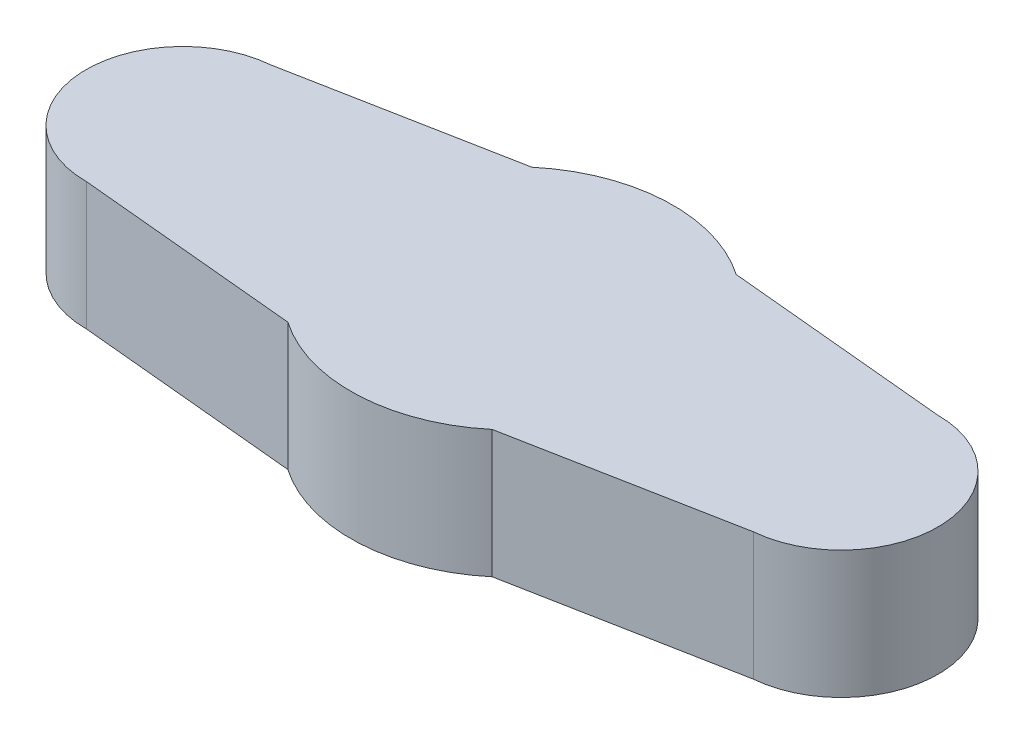
ISO-10303-21;
HEADER;
FILE_DESCRIPTION(('STEP AP214'),'2;1');
FILE_NAME('part.step','',(''),(''),'','','');
FILE_SCHEMA(('AUTOMOTIVE_DESIGN { 1 0 10303 214 1 1 1 1 }'));
ENDSEC;
DATA;
#1=APPLICATION_CONTEXT('core data for automotive mechanical design processes');
#2=APPLICATION_PROTOCOL_DEFINITION('international standard','automotive_design',2000,#1);
#3=PRODUCT_CONTEXT('',#1,'mechanical');
#4=PRODUCT('Part','Part','',(#3));
#5=PRODUCT_RELATED_PRODUCT_CATEGORY('part','',(#4));
#6=PRODUCT_DEFINITION_FORMATION('','',#4);
#7=PRODUCT_DEFINITION_CONTEXT('part definition',#1,'design');
#8=PRODUCT_DEFINITION('design','',#6,#7);
#9=PRODUCT_DEFINITION_SHAPE('','',#8);
#10=(LENGTH_UNIT() NAMED_UNIT(*) SI_UNIT(.MILLI.,.METRE.));
#11=(NAMED_UNIT(*) PLANE_ANGLE_UNIT() SI_UNIT($,.RADIAN.));
#12=(NAMED_UNIT(*) SI_UNIT($,.STERADIAN.) SOLID_ANGLE_UNIT());
#13=UNCERTAINTY_MEASURE_WITH_UNIT(LENGTH_MEASURE(1.E-05),#10,'distance_accuracy_value','');
#14=(GEOMETRIC_REPRESENTATION_CONTEXT(3) GLOBAL_UNCERTAINTY_ASSIGNED_CONTEXT((#13)) GLOBAL_UNIT_ASSIGNED_CONTEXT((#10,
#11,#12)) REPRESENTATION_CONTEXT('',''));
#15=CARTESIAN_POINT('',(0.,0.,0.));
#16=DIRECTION('',(0.,0.,1.));
#17=DIRECTION('',(1.,0.,0.));
#18=AXIS2_PLACEMENT_3D('',#15,#16,#17);
#19=CARTESIAN_POINT('',(0.,19.05,0.));
#20=DIRECTION('',(0.,1.,0.));
#21=DIRECTION('',(0.,0.,1.));
#22=AXIS2_PLACEMENT_3D('',#19,#20,#21);
#23=PLANE('',#22);
#24=CARTESIAN_POINT('',(11.4299999999997,19.05,-4.44089209850063E-13));
#25=DIRECTION('',(0.,1.,0.));
#26=DIRECTION('',(0.,0.,1.));
#27=AXIS2_PLACEMENT_3D('',#24,#25,#26);
#28=CIRCLE('',#27,2.032);
#29=CARTESIAN_POINT('',(11.4299999999997,19.05,2.03199999999955));
#30=VERTEX_POINT('',#29);
#31=EDGE_CURVE('E239',#30,#30,#28,.T.);
#32=ORIENTED_EDGE('',*,*,#31,.T.);
#33=EDGE_LOOP('',(#32));
#34=FACE_BOUND('',#33,.T.);
#35=CARTESIAN_POINT('',(11.4299999999997,19.05,-4.44089209850063E-13));
#36=DIRECTION('',(0.,1.,0.));
#37=DIRECTION('',(0.,0.,1.));
#38=AXIS2_PLACEMENT_3D('',#35,#36,#37);
#39=CIRCLE('',#38,5.9182);
#40=CARTESIAN_POINT('',(15.2680263966815,19.05,-4.50495778208606));
#41=VERTEX_POINT('',#40);
#42=CARTESIAN_POINT('',(7.18268751011818,19.05,-4.12133811441138));
#43=VERTEX_POINT('',#42);
#44=EDGE_CURVE('E231',#41,#43,#39,.T.);
#45=ORIENTED_EDGE('',*,*,#44,.F.);
#46=DIRECTION('',(-0.995557261223967,0.,-0.0941580566082036));
#47=VECTOR('',#46,1.);
#48=CARTESIAN_POINT('',(0.557655904113208,19.05,-5.89623877768044));
#49=LINE('',#48,#47);
#50=CARTESIAN_POINT('',(27.8010697747138,19.05,-3.31960455949895));
#51=VERTEX_POINT('',#50);
#52=EDGE_CURVE('E226',#51,#41,#49,.T.);
#53=ORIENTED_EDGE('',*,*,#52,.F.);
#54=CARTESIAN_POINT('',(27.9214480374196,19.05,-0.782458707588194));
#55=DIRECTION('',(0.,1.,0.));
#56=DIRECTION('',(0.,0.,1.));
#57=AXIS2_PLACEMENT_3D('',#54,#55,#56);
#58=CIRCLE('',#57,2.54);
#59=CARTESIAN_POINT('',(28.0418263001254,19.05,1.75468714432256));
#60=VERTEX_POINT('',#59);
#61=EDGE_CURVE('E221',#60,#51,#58,.T.);
#62=ORIENTED_EDGE('',*,*,#61,.F.);
#63=DIRECTION('',(0.982170182772097,0.,-0.187993968183625));
#64=VECTOR('',#63,1.);
#65=CARTESIAN_POINT('',(1.31503577863829,19.05,6.87037431858157));
#66=LINE('',#65,#64);
#67=CARTESIAN_POINT('',(15.6773124898813,19.05,4.12133811441049));
#68=VERTEX_POINT('',#67);
#69=EDGE_CURVE('E216',#68,#60,#66,.T.);
#70=ORIENTED_EDGE('',*,*,#69,.F.);
#71=CARTESIAN_POINT('',(11.4299999999997,19.05,-4.44089209850063E-13));
#72=DIRECTION('',(0.,1.,0.));
#73=DIRECTION('',(0.,0.,1.));
#74=AXIS2_PLACEMENT_3D('',#71,#72,#73);
#75=CIRCLE('',#74,5.9182);
#76=CARTESIAN_POINT('',(7.59197360331792,19.05,4.50495778208517));
#77=VERTEX_POINT('',#76);
#78=EDGE_CURVE('E211',#77,#68,#75,.T.);
#79=ORIENTED_EDGE('',*,*,#78,.F.);
#80=DIRECTION('',(0.995557261223967,0.,0.0941580566082036));
#81=VECTOR('',#80,1.);
#82=CARTESIAN_POINT('',(-0.354985096303148,19.05,3.75334839079609));
#83=LINE('',#82,#81);
#84=CARTESIAN_POINT('',(-4.94106977471436,19.05,3.31960455949806));
#85=VERTEX_POINT('',#84);
#86=EDGE_CURVE('E206',#85,#77,#83,.T.);
#87=ORIENTED_EDGE('',*,*,#86,.F.);
#88=CARTESIAN_POINT('',(-5.06144803742017,19.05,0.782458707587305));
#89=DIRECTION('',(0.,1.,0.));
#90=DIRECTION('',(0.,0.,1.));
#91=AXIS2_PLACEMENT_3D('',#88,#89,#90);
#92=CIRCLE('',#91,2.54);
#93=CARTESIAN_POINT('',(-5.18182630012598,19.05,-1.75468714432345));
#94=VERTEX_POINT('',#93);
#95=EDGE_CURVE('E67',#94,#85,#92,.T.);
#96=ORIENTED_EDGE('',*,*,#95,.F.);
#97=DIRECTION('',(-0.982170182772097,0.,0.187993968183625));
#98=VECTOR('',#97,1.);
#99=CARTESIAN_POINT('',(-0.507123783439963,19.05,-2.64945659630314));
#100=LINE('',#99,#98);
#101=EDGE_CURVE('E62',#43,#94,#100,.T.);
#102=ORIENTED_EDGE('',*,*,#101,.F.);
#103=EDGE_LOOP('',(#45,#53,#62,#70,#79,#87,#96,#102));
#104=FACE_BOUND('',#103,.T.);
#105=ADVANCED_FACE('F47',(#34,#104),#23,.F.);
#106=CARTESIAN_POINT('',(-0.984628462626367,21.209,-5.1441688605442));
#107=DIRECTION('',(0.187993968183626,0.,0.982170182772097));
#108=DIRECTION('',(0.982170182772097,0.,-0.187993968183626));
#109=AXIS2_PLACEMENT_3D('',#106,#107,#108);
#110=PLANE('',#109);
#111=DIRECTION('',(0.,-1.,0.));
#112=VECTOR('',#111,1.);
#113=CARTESIAN_POINT('',(5.99380688752038,21.209,-6.47988824624601));
#114=LINE('',#113,#112);
#115=CARTESIAN_POINT('',(5.99380688752036,23.209,-6.47988824624603));
#116=VERTEX_POINT('',#115);
#117=CARTESIAN_POINT('',(5.99380688752036,16.51,-6.47988824624603));
#118=VERTEX_POINT('',#117);
#119=EDGE_CURVE('E292',#116,#118,#114,.T.);
#120=ORIENTED_EDGE('',*,*,#119,.T.);
#121=DIRECTION('',(0.982170182772097,0.,-0.187993968183626));
#122=VECTOR('',#121,1.);
#123=CARTESIAN_POINT('',(-0.984628462626367,16.51,-5.1441688605442));
#124=LINE('',#123,#122);
#125=CARTESIAN_POINT('',(-5.5127598912651,16.51,-4.27745409903099));
#126=VERTEX_POINT('',#125);
#127=EDGE_CURVE('E229',#126,#118,#124,.T.);
#128=ORIENTED_EDGE('',*,*,#127,.F.);
#129=DIRECTION('',(0.,-1.,0.));
#130=VECTOR('',#129,1.);
#131=CARTESIAN_POINT('',(-5.5127598912651,21.209,-4.27745409903091));
#132=LINE('',#131,#130);
#133=CARTESIAN_POINT('',(-5.51275989126509,23.209,-4.27745409903091));
#134=VERTEX_POINT('',#133);
#135=EDGE_CURVE('E11',#134,#126,#132,.T.);
#136=ORIENTED_EDGE('',*,*,#135,.F.);
#137=DIRECTION('',(0.982170182772097,0.,-0.187993968183626));
#138=VECTOR('',#137,1.);
#139=CARTESIAN_POINT('',(-0.984628462626366,23.209,-5.1441688605442));
#140=LINE('',#139,#138);
#141=EDGE_CURVE('E194',#134,#116,#140,.T.);
#142=ORIENTED_EDGE('',*,*,#141,.T.);
#143=EDGE_LOOP('',(#120,#128,#136,#142));
#144=FACE_BOUND('',#143,.T.);
#145=ADVANCED_FACE('F49',(#144),#110,.F.);
#146=CARTESIAN_POINT('',(-5.06144803742015,21.209,0.782458707587308));
#147=DIRECTION('',(0.,-1.,0.));
#148=DIRECTION('',(0.,0.,-1.));
#149=AXIS2_PLACEMENT_3D('',#146,#147,#148);
#150=CYLINDRICAL_SURFACE('',#149,5.08000000000008);
#151=ORIENTED_EDGE('',*,*,#135,.T.);
#152=CARTESIAN_POINT('',(-5.06144803742015,16.51,0.782458707587308));
#153=DIRECTION('',(0.,1.,0.));
#154=DIRECTION('',(0.,0.,1.));
#155=AXIS2_PLACEMENT_3D('',#152,#153,#154);
#156=CIRCLE('',#155,5.08000000000008);
#157=CARTESIAN_POINT('',(-5.03166237176866,16.51,5.86237138539225));
#158=VERTEX_POINT('',#157);
#159=EDGE_CURVE('E236',#158,#126,#156,.F.);
#160=ORIENTED_EDGE('',*,*,#159,.F.);
#161=DIRECTION('',(0.,-1.,0.));
#162=VECTOR('',#161,1.);
#163=CARTESIAN_POINT('',(-5.03166237176866,21.209,5.86237138539225));
#164=LINE('',#163,#162);
#165=CARTESIAN_POINT('',(-5.03166237176867,23.209,5.86237138539217));
#166=VERTEX_POINT('',#165);
#167=EDGE_CURVE('E55',#166,#158,#164,.T.);
#168=ORIENTED_EDGE('',*,*,#167,.F.);
#169=CARTESIAN_POINT('',(-5.06144803742015,23.209,0.782458707587308));
#170=DIRECTION('',(0.,1.,0.));
#171=DIRECTION('',(0.,0.,1.));
#172=AXIS2_PLACEMENT_3D('',#169,#170,#171);
#173=CIRCLE('',#172,5.08000000000008);
#174=EDGE_CURVE('E191',#134,#166,#173,.T.);
#175=ORIENTED_EDGE('',*,*,#174,.F.);
#176=EDGE_LOOP('',(#151,#160,#168,#175));
#177=FACE_BOUND('',#176,.T.);
#178=ADVANCED_FACE('F311',(#177),#150,.T.);
#179=CARTESIAN_POINT('',(-0.594146560087953,21.209,6.28206383430505));
#180=DIRECTION('',(0.0941580566081974,0.,-0.995557261223968));
#181=DIRECTION('',(-0.995557261223968,0.,-0.0941580566081974));
#182=AXIS2_PLACEMENT_3D('',#179,#180,#181);
#183=PLANE('',#182);
#184=ORIENTED_EDGE('',*,*,#167,.T.);
#185=DIRECTION('',(-0.995557261223968,0.,-0.0941580566081974));
#186=VECTOR('',#185,1.);
#187=CARTESIAN_POINT('',(-0.594146560087953,16.51,6.28206383430505));
#188=LINE('',#187,#186);
#189=CARTESIAN_POINT('',(6.63174007040923,16.51,6.96547549619408));
#190=VERTEX_POINT('',#189);
#191=EDGE_CURVE('E240',#190,#158,#188,.T.);
#192=ORIENTED_EDGE('',*,*,#191,.F.);
#193=DIRECTION('',(0.,-1.,0.));
#194=VECTOR('',#193,1.);
#195=CARTESIAN_POINT('',(6.63174007040923,21.209,6.96547549619408));
#196=LINE('',#195,#194);
#197=CARTESIAN_POINT('',(6.63174007040925,23.209,6.96547549619409));
#198=VERTEX_POINT('',#197);
#199=EDGE_CURVE('E298',#198,#190,#196,.T.);
#200=ORIENTED_EDGE('',*,*,#199,.F.);
#201=DIRECTION('',(-0.995557261223968,0.,-0.0941580566081974));
#202=VECTOR('',#201,1.);
#203=CARTESIAN_POINT('',(-0.594146560087953,23.209,6.28206383430505));
#204=LINE('',#203,#202);
#205=EDGE_CURVE('E188',#198,#166,#204,.T.);
#206=ORIENTED_EDGE('',*,*,#205,.T.);
#207=EDGE_LOOP('',(#184,#192,#200,#206));
#208=FACE_BOUND('',#207,.T.);
#209=ADVANCED_FACE('F301',(#208),#183,.F.);
#210=CARTESIAN_POINT('',(11.4299999999997,21.209,-4.44089209850063E-13));
#211=DIRECTION('',(0.,-1.,0.));
#212=DIRECTION('',(0.,0.,-1.));
#213=AXIS2_PLACEMENT_3D('',#210,#211,#212);
#214=CYLINDRICAL_SURFACE('',#213,8.45819999999998);
#215=ORIENTED_EDGE('',*,*,#199,.T.);
#216=CARTESIAN_POINT('',(11.4299999999997,16.51,-4.44089209850063E-13));
#217=DIRECTION('',(0.,1.,0.));
#218=DIRECTION('',(0.,0.,1.));
#219=AXIS2_PLACEMENT_3D('',#216,#217,#218);
#220=CIRCLE('',#219,8.45819999999998);
#221=CARTESIAN_POINT('',(16.8661931124791,16.51,6.47988824624514));
#222=VERTEX_POINT('',#221);
#223=EDGE_CURVE('E283',#222,#190,#220,.F.);
#224=ORIENTED_EDGE('',*,*,#223,.F.);
#225=DIRECTION('',(0.,-1.,0.));
#226=VECTOR('',#225,1.);
#227=CARTESIAN_POINT('',(16.8661931124791,21.209,6.47988824624512));
#228=LINE('',#227,#226);
#229=CARTESIAN_POINT('',(16.8661931124791,23.209,6.47988824624513));
#230=VERTEX_POINT('',#229);
#231=EDGE_CURVE('E296',#230,#222,#228,.T.);
#232=ORIENTED_EDGE('',*,*,#231,.F.);
#233=CARTESIAN_POINT('',(11.4299999999997,23.209,-4.44089209850063E-13));
#234=DIRECTION('',(0.,1.,0.));
#235=DIRECTION('',(0.,0.,1.));
#236=AXIS2_PLACEMENT_3D('',#233,#234,#235);
#237=CIRCLE('',#236,8.45819999999998);
#238=EDGE_CURVE('E186',#198,#230,#237,.T.);
#239=ORIENTED_EDGE('',*,*,#238,.F.);
#240=EDGE_LOOP('',(#215,#224,#232,#239));
#241=FACE_BOUND('',#240,.T.);
#242=ADVANCED_FACE('F322',(#241),#214,.T.);
#243=CARTESIAN_POINT('',(1.79254045782471,21.209,9.36508658282267));
#244=DIRECTION('',(-0.187993968183626,0.,-0.982170182772097));
#245=DIRECTION('',(-0.982170182772097,0.,0.187993968183626));
#246=AXIS2_PLACEMENT_3D('',#243,#244,#245);
#247=PLANE('',#246);
#248=ORIENTED_EDGE('',*,*,#231,.T.);
#249=DIRECTION('',(-0.982170182772097,0.,0.187993968183626));
#250=VECTOR('',#249,1.);
#251=CARTESIAN_POINT('',(1.79254045782471,16.51,9.36508658282267));
#252=LINE('',#251,#250);
#253=CARTESIAN_POINT('',(28.3727598912645,16.51,4.27745409903002));
#254=VERTEX_POINT('',#253);
#255=EDGE_CURVE('E280',#254,#222,#252,.T.);
#256=ORIENTED_EDGE('',*,*,#255,.F.);
#257=DIRECTION('',(0.,-1.,0.));
#258=VECTOR('',#257,1.);
#259=CARTESIAN_POINT('',(28.3727598912645,21.209,4.27745409903002));
#260=LINE('',#259,#258);
#261=CARTESIAN_POINT('',(28.3727598912645,23.209,4.27745409903002));
#262=VERTEX_POINT('',#261);
#263=EDGE_CURVE('E169',#262,#254,#260,.T.);
#264=ORIENTED_EDGE('',*,*,#263,.F.);
#265=DIRECTION('',(-0.982170182772097,0.,0.187993968183626));
#266=VECTOR('',#265,1.);
#267=CARTESIAN_POINT('',(1.79254045782471,23.209,9.36508658282268));
#268=LINE('',#267,#266);
#269=EDGE_CURVE('E179',#262,#230,#268,.T.);
#270=ORIENTED_EDGE('',*,*,#269,.T.);
#271=EDGE_LOOP('',(#248,#256,#264,#270));
#272=FACE_BOUND('',#271,.T.);
#273=ADVANCED_FACE('F320',(#272),#247,.F.);
#274=CARTESIAN_POINT('',(27.9214480374196,21.209,-0.782458707588196));
#275=DIRECTION('',(0.,-1.,0.));
#276=DIRECTION('',(0.,0.,-1.));
#277=AXIS2_PLACEMENT_3D('',#274,#275,#276);
#278=CYLINDRICAL_SURFACE('',#277,5.08000000000008);
#279=ORIENTED_EDGE('',*,*,#263,.T.);
#280=CARTESIAN_POINT('',(27.9214480374196,16.51,-0.782458707588196));
#281=DIRECTION('',(0.,1.,0.));
#282=DIRECTION('',(0.,0.,1.));
#283=AXIS2_PLACEMENT_3D('',#280,#281,#282);
#284=CIRCLE('',#283,5.08000000000008);
#285=CARTESIAN_POINT('',(27.8916623717681,16.51,-5.86237138539306));
#286=VERTEX_POINT('',#285);
#287=EDGE_CURVE('E164',#286,#254,#284,.F.);
#288=ORIENTED_EDGE('',*,*,#287,.F.);
#289=DIRECTION('',(0.,-1.,0.));
#290=VECTOR('',#289,1.);
#291=CARTESIAN_POINT('',(27.8916623717681,21.209,-5.86237138539314));
#292=LINE('',#291,#290);
#293=CARTESIAN_POINT('',(27.8916623717681,23.209,-5.86237138539306));
#294=VERTEX_POINT('',#293);
#295=EDGE_CURVE('E158',#294,#286,#292,.T.);
#296=ORIENTED_EDGE('',*,*,#295,.F.);
#297=CARTESIAN_POINT('',(27.9214480374196,23.209,-0.782458707588196));
#298=DIRECTION('',(0.,1.,0.));
#299=DIRECTION('',(0.,0.,1.));
#300=AXIS2_PLACEMENT_3D('',#297,#298,#299);
#301=CIRCLE('',#300,5.08000000000008);
#302=EDGE_CURVE('E161',#262,#294,#301,.T.);
#303=ORIENTED_EDGE('',*,*,#302,.F.);
#304=EDGE_LOOP('',(#279,#288,#296,#303));
#305=FACE_BOUND('',#304,.T.);
#306=ADVANCED_FACE('F160',(#305),#278,.T.);
#307=CARTESIAN_POINT('',(0.796817367897986,21.209,-8.42495422118926));
#308=DIRECTION('',(-0.0941580566081974,0.,0.995557261223968));
#309=DIRECTION('',(0.995557261223968,0.,0.0941580566081974));
#310=AXIS2_PLACEMENT_3D('',#307,#308,#309);
#311=PLANE('',#310);
#312=ORIENTED_EDGE('',*,*,#295,.T.);
#313=DIRECTION('',(0.995557261223968,0.,0.0941580566081974));
#314=VECTOR('',#313,1.);
#315=CARTESIAN_POINT('',(0.796817367897986,16.51,-8.42495422118926));
#316=LINE('',#315,#314);
#317=CARTESIAN_POINT('',(16.2282599295902,16.51,-6.96547549619497));
#318=VERTEX_POINT('',#317);
#319=EDGE_CURVE('E277',#318,#286,#316,.T.);
#320=ORIENTED_EDGE('',*,*,#319,.F.);
#321=DIRECTION('',(0.,-1.,0.));
#322=VECTOR('',#321,1.);
#323=CARTESIAN_POINT('',(16.2282599295902,21.209,-6.96547549619497));
#324=LINE('',#323,#322);
#325=CARTESIAN_POINT('',(16.2282599295902,23.209,-6.96547549619495));
#326=VERTEX_POINT('',#325);
#327=EDGE_CURVE('E170',#326,#318,#324,.T.);
#328=ORIENTED_EDGE('',*,*,#327,.F.);
#329=DIRECTION('',(0.995557261223968,0.,0.0941580566081974));
#330=VECTOR('',#329,1.);
#331=CARTESIAN_POINT('',(0.796817367897986,23.209,-8.42495422118926));
#332=LINE('',#331,#330);
#333=EDGE_CURVE('E176',#326,#294,#332,.T.);
#334=ORIENTED_EDGE('',*,*,#333,.T.);
#335=EDGE_LOOP('',(#312,#320,#328,#334));
#336=FACE_BOUND('',#335,.T.);
#337=ADVANCED_FACE('F181',(#336),#311,.F.);
#338=CARTESIAN_POINT('',(11.4299999999997,21.209,-4.44089209850063E-13));
#339=DIRECTION('',(0.,-1.,0.));
#340=DIRECTION('',(0.,0.,-1.));
#341=AXIS2_PLACEMENT_3D('',#338,#339,#340);
#342=CYLINDRICAL_SURFACE('',#341,8.45819999999998);
#343=ORIENTED_EDGE('',*,*,#327,.T.);
#344=CARTESIAN_POINT('',(11.4299999999997,16.51,-4.44089209850063E-13));
#345=DIRECTION('',(0.,1.,0.));
#346=DIRECTION('',(0.,0.,1.));
#347=AXIS2_PLACEMENT_3D('',#344,#345,#346);
#348=CIRCLE('',#347,8.45819999999998);
#349=EDGE_CURVE('E274',#118,#318,#348,.F.);
#350=ORIENTED_EDGE('',*,*,#349,.F.);
#351=ORIENTED_EDGE('',*,*,#119,.F.);
#352=CARTESIAN_POINT('',(11.4299999999997,23.209,-4.44089209850063E-13));
#353=DIRECTION('',(0.,1.,0.));
#354=DIRECTION('',(0.,0.,1.));
#355=AXIS2_PLACEMENT_3D('',#352,#353,#354);
#356=CIRCLE('',#355,8.45819999999998);
#357=EDGE_CURVE('E197',#326,#116,#356,.T.);
#358=ORIENTED_EDGE('',*,*,#357,.F.);
#359=EDGE_LOOP('',(#343,#350,#351,#358));
#360=FACE_BOUND('',#359,.T.);
#361=ADVANCED_FACE('F316',(#360),#342,.T.);
#362=CARTESIAN_POINT('',(11.4299999999997,21.209,-4.44089209850063E-13));
#363=DIRECTION('',(0.,-1.,0.));
#364=DIRECTION('',(0.,0.,-1.));
#365=AXIS2_PLACEMENT_3D('',#362,#363,#364);
#366=CYLINDRICAL_SURFACE('',#365,2.032);
#367=CARTESIAN_POINT('',(11.4299999999997,21.209,-4.44089209850063E-13));
#368=DIRECTION('',(0.,1.,0.));
#369=DIRECTION('',(0.,0.,1.));
#370=AXIS2_PLACEMENT_3D('',#367,#368,#369);
#371=CIRCLE('',#370,2.032);
#372=CARTESIAN_POINT('',(11.4299999999997,21.209,2.03199999999955));
#373=VERTEX_POINT('',#372);
#374=EDGE_CURVE('E199',#373,#373,#371,.T.);
#375=ORIENTED_EDGE('',*,*,#374,.T.);
#376=EDGE_LOOP('',(#375));
#377=FACE_BOUND('',#376,.T.);
#378=ORIENTED_EDGE('',*,*,#31,.F.);
#379=EDGE_LOOP('',(#378));
#380=FACE_BOUND('',#379,.T.);
#381=ADVANCED_FACE('F342',(#377,#380),#366,.F.);
#382=CARTESIAN_POINT('',(11.4299999999997,-29.8308466763873,-4.44089209850063E-13));
#383=DIRECTION('',(0.,1.,0.));
#384=DIRECTION('',(0.,0.,1.));
#385=AXIS2_PLACEMENT_3D('',#382,#383,#384);
#386=CYLINDRICAL_SURFACE('',#385,5.9182);
#387=DIRECTION('',(0.,1.,0.));
#388=VECTOR('',#387,1.);
#389=CARTESIAN_POINT('',(7.18268751011818,-29.8308466763873,-4.12133811441138));
#390=LINE('',#389,#388);
#391=CARTESIAN_POINT('',(7.18268751011818,16.51,-4.12133811441138));
#392=VERTEX_POINT('',#391);
#393=EDGE_CURVE('E202',#392,#43,#390,.T.);
#394=ORIENTED_EDGE('',*,*,#393,.F.);
#395=CARTESIAN_POINT('',(11.4299999999997,16.51,-4.44089209850063E-13));
#396=DIRECTION('',(0.,1.,0.));
#397=DIRECTION('',(0.,0.,1.));
#398=AXIS2_PLACEMENT_3D('',#395,#396,#397);
#399=CIRCLE('',#398,5.9182);
#400=CARTESIAN_POINT('',(15.2680263966815,16.51,-4.50495778208606));
#401=VERTEX_POINT('',#400);
#402=EDGE_CURVE('E255',#392,#401,#399,.F.);
#403=ORIENTED_EDGE('',*,*,#402,.T.);
#404=DIRECTION('',(0.,1.,0.));
#405=VECTOR('',#404,1.);
#406=CARTESIAN_POINT('',(15.2680263966815,-29.8308466763873,-4.50495778208606));
#407=LINE('',#406,#405);
#408=EDGE_CURVE('E235',#401,#41,#407,.T.);
#409=ORIENTED_EDGE('',*,*,#408,.T.);
#410=ORIENTED_EDGE('',*,*,#44,.T.);
#411=EDGE_LOOP('',(#394,#403,#409,#410));
#412=FACE_BOUND('',#411,.T.);
#413=ADVANCED_FACE('F344',(#412),#386,.F.);
#414=CARTESIAN_POINT('',(-0.507123783439963,-29.8308466763873,-2.64945659630314));
#415=DIRECTION('',(-0.187993968183625,0.,-0.982170182772097));
#416=DIRECTION('',(-0.982170182772097,0.,0.187993968183625));
#417=AXIS2_PLACEMENT_3D('',#414,#415,#416);
#418=PLANE('',#417);
#419=DIRECTION('',(0.,1.,0.));
#420=VECTOR('',#419,1.);
#421=CARTESIAN_POINT('',(-5.18182630012598,-29.8308466763873,-1.75468714432345));
#422=LINE('',#421,#420);
#423=CARTESIAN_POINT('',(-5.18182630012598,16.51,-1.75468714432345));
#424=VERTEX_POINT('',#423);
#425=EDGE_CURVE('E205',#424,#94,#422,.T.);
#426=ORIENTED_EDGE('',*,*,#425,.F.);
#427=DIRECTION('',(0.982170182772097,0.,-0.187993968183625));
#428=VECTOR('',#427,1.);
#429=CARTESIAN_POINT('',(-0.507123783439963,16.51,-2.64945659630314));
#430=LINE('',#429,#428);
#431=EDGE_CURVE('E234',#424,#392,#430,.T.);
#432=ORIENTED_EDGE('',*,*,#431,.T.);
#433=ORIENTED_EDGE('',*,*,#393,.T.);
#434=ORIENTED_EDGE('',*,*,#101,.T.);
#435=EDGE_LOOP('',(#426,#432,#433,#434));
#436=FACE_BOUND('',#435,.T.);
#437=ADVANCED_FACE('F450',(#436),#418,.F.);
#438=CARTESIAN_POINT('',(-5.06144803742017,-29.8308466763873,0.782458707587305));
#439=DIRECTION('',(0.,1.,0.));
#440=DIRECTION('',(0.,0.,1.));
#441=AXIS2_PLACEMENT_3D('',#438,#439,#440);
#442=CYLINDRICAL_SURFACE('',#441,2.54);
#443=DIRECTION('',(0.,1.,0.));
#444=VECTOR('',#443,1.);
#445=CARTESIAN_POINT('',(-4.94106977471436,-29.8308466763873,3.31960455949806));
#446=LINE('',#445,#444);
#447=CARTESIAN_POINT('',(-4.94106977471436,16.51,3.31960455949806));
#448=VERTEX_POINT('',#447);
#449=EDGE_CURVE('E210',#448,#85,#446,.T.);
#450=ORIENTED_EDGE('',*,*,#449,.F.);
#451=CARTESIAN_POINT('',(-5.06144803742017,16.51,0.782458707587305));
#452=DIRECTION('',(0.,1.,0.));
#453=DIRECTION('',(0.,0.,1.));
#454=AXIS2_PLACEMENT_3D('',#451,#452,#453);
#455=CIRCLE('',#454,2.54);
#456=EDGE_CURVE('E201',#448,#424,#455,.F.);
#457=ORIENTED_EDGE('',*,*,#456,.T.);
#458=ORIENTED_EDGE('',*,*,#425,.T.);
#459=ORIENTED_EDGE('',*,*,#95,.T.);
#460=EDGE_LOOP('',(#450,#457,#458,#459));
#461=FACE_BOUND('',#460,.T.);
#462=ADVANCED_FACE('F440',(#461),#442,.F.);
#463=CARTESIAN_POINT('',(-0.354985096303148,-29.8308466763873,3.75334839079609));
#464=DIRECTION('',(-0.0941580566082036,0.,0.995557261223967));
#465=DIRECTION('',(0.995557261223967,0.,0.0941580566082036));
#466=AXIS2_PLACEMENT_3D('',#463,#464,#465);
#467=PLANE('',#466);
#468=DIRECTION('',(0.,1.,0.));
#469=VECTOR('',#468,1.);
#470=CARTESIAN_POINT('',(7.59197360331792,-29.8308466763873,4.50495778208517));
#471=LINE('',#470,#469);
#472=CARTESIAN_POINT('',(7.59197360331792,16.51,4.50495778208517));
#473=VERTEX_POINT('',#472);
#474=EDGE_CURVE('E215',#473,#77,#471,.T.);
#475=ORIENTED_EDGE('',*,*,#474,.F.);
#476=DIRECTION('',(-0.995557261223967,0.,-0.0941580566082036));
#477=VECTOR('',#476,1.);
#478=CARTESIAN_POINT('',(-0.354985096303148,16.51,3.75334839079609));
#479=LINE('',#478,#477);
#480=EDGE_CURVE('E204',#473,#448,#479,.T.);
#481=ORIENTED_EDGE('',*,*,#480,.T.);
#482=ORIENTED_EDGE('',*,*,#449,.T.);
#483=ORIENTED_EDGE('',*,*,#86,.T.);
#484=EDGE_LOOP('',(#475,#481,#482,#483));
#485=FACE_BOUND('',#484,.T.);
#486=ADVANCED_FACE('F430',(#485),#467,.F.);
#487=CARTESIAN_POINT('',(11.4299999999997,-29.8308466763873,-4.44089209850063E-13));
#488=DIRECTION('',(0.,1.,0.));
#489=DIRECTION('',(0.,0.,1.));
#490=AXIS2_PLACEMENT_3D('',#487,#488,#489);
#491=CYLINDRICAL_SURFACE('',#490,5.9182);
#492=DIRECTION('',(0.,1.,0.));
#493=VECTOR('',#492,1.);
#494=CARTESIAN_POINT('',(15.6773124898813,-29.8308466763873,4.12133811441049));
#495=LINE('',#494,#493);
#496=CARTESIAN_POINT('',(15.6773124898813,16.51,4.12133811441049));
#497=VERTEX_POINT('',#496);
#498=EDGE_CURVE('E220',#497,#68,#495,.T.);
#499=ORIENTED_EDGE('',*,*,#498,.F.);
#500=CARTESIAN_POINT('',(11.4299999999997,16.51,-4.44089209850063E-13));
#501=DIRECTION('',(0.,1.,0.));
#502=DIRECTION('',(0.,0.,1.));
#503=AXIS2_PLACEMENT_3D('',#500,#501,#502);
#504=CIRCLE('',#503,5.9182);
#505=EDGE_CURVE('E209',#497,#473,#504,.F.);
#506=ORIENTED_EDGE('',*,*,#505,.T.);
#507=ORIENTED_EDGE('',*,*,#474,.T.);
#508=ORIENTED_EDGE('',*,*,#78,.T.);
#509=EDGE_LOOP('',(#499,#506,#507,#508));
#510=FACE_BOUND('',#509,.T.);
#511=ADVANCED_FACE('F420',(#510),#491,.F.);
#512=CARTESIAN_POINT('',(1.31503577863829,-29.8308466763873,6.87037431858157));
#513=DIRECTION('',(0.187993968183625,0.,0.982170182772097));
#514=DIRECTION('',(0.982170182772097,0.,-0.187993968183625));
#515=AXIS2_PLACEMENT_3D('',#512,#513,#514);
#516=PLANE('',#515);
#517=DIRECTION('',(0.,1.,0.));
#518=VECTOR('',#517,1.);
#519=CARTESIAN_POINT('',(28.0418263001254,-29.8308466763873,1.75468714432256));
#520=LINE('',#519,#518);
#521=CARTESIAN_POINT('',(28.0418263001254,16.51,1.75468714432256));
#522=VERTEX_POINT('',#521);
#523=EDGE_CURVE('E225',#522,#60,#520,.T.);
#524=ORIENTED_EDGE('',*,*,#523,.F.);
#525=DIRECTION('',(-0.982170182772097,0.,0.187993968183625));
#526=VECTOR('',#525,1.);
#527=CARTESIAN_POINT('',(1.31503577863829,16.51,6.87037431858157));
#528=LINE('',#527,#526);
#529=EDGE_CURVE('E214',#522,#497,#528,.T.);
#530=ORIENTED_EDGE('',*,*,#529,.T.);
#531=ORIENTED_EDGE('',*,*,#498,.T.);
#532=ORIENTED_EDGE('',*,*,#69,.T.);
#533=EDGE_LOOP('',(#524,#530,#531,#532));
#534=FACE_BOUND('',#533,.T.);
#535=ADVANCED_FACE('F410',(#534),#516,.F.);
#536=CARTESIAN_POINT('',(27.9214480374196,-29.8308466763873,-0.782458707588194));
#537=DIRECTION('',(0.,1.,0.));
#538=DIRECTION('',(0.,0.,1.));
#539=AXIS2_PLACEMENT_3D('',#536,#537,#538);
#540=CYLINDRICAL_SURFACE('',#539,2.54);
#541=DIRECTION('',(0.,1.,0.));
#542=VECTOR('',#541,1.);
#543=CARTESIAN_POINT('',(27.8010697747138,-29.8308466763873,-3.31960455949895));
#544=LINE('',#543,#542);
#545=CARTESIAN_POINT('',(27.8010697747138,16.51,-3.31960455949895));
#546=VERTEX_POINT('',#545);
#547=EDGE_CURVE('E230',#546,#51,#544,.T.);
#548=ORIENTED_EDGE('',*,*,#547,.F.);
#549=CARTESIAN_POINT('',(27.9214480374196,16.51,-0.782458707588194));
#550=DIRECTION('',(0.,1.,0.));
#551=DIRECTION('',(0.,0.,1.));
#552=AXIS2_PLACEMENT_3D('',#549,#550,#551);
#553=CIRCLE('',#552,2.54);
#554=EDGE_CURVE('E219',#546,#522,#553,.F.);
#555=ORIENTED_EDGE('',*,*,#554,.T.);
#556=ORIENTED_EDGE('',*,*,#523,.T.);
#557=ORIENTED_EDGE('',*,*,#61,.T.);
#558=EDGE_LOOP('',(#548,#555,#556,#557));
#559=FACE_BOUND('',#558,.T.);
#560=ADVANCED_FACE('F400',(#559),#540,.F.);
#561=CARTESIAN_POINT('',(0.557655904113208,-29.8308466763873,-5.89623877768044));
#562=DIRECTION('',(0.0941580566082036,0.,-0.995557261223967));
#563=DIRECTION('',(-0.995557261223967,0.,-0.0941580566082036));
#564=AXIS2_PLACEMENT_3D('',#561,#562,#563);
#565=PLANE('',#564);
#566=ORIENTED_EDGE('',*,*,#408,.F.);
#567=DIRECTION('',(0.995557261223967,0.,0.0941580566082036));
#568=VECTOR('',#567,1.);
#569=CARTESIAN_POINT('',(0.557655904113208,16.51,-5.89623877768044));
#570=LINE('',#569,#568);
#571=EDGE_CURVE('E224',#401,#546,#570,.T.);
#572=ORIENTED_EDGE('',*,*,#571,.T.);
#573=ORIENTED_EDGE('',*,*,#547,.T.);
#574=ORIENTED_EDGE('',*,*,#52,.T.);
#575=EDGE_LOOP('',(#566,#572,#573,#574));
#576=FACE_BOUND('',#575,.T.);
#577=ADVANCED_FACE('F391',(#576),#565,.F.);
#578=CARTESIAN_POINT('',(11.4299999999997,16.51,-4.44089209850063E-13));
#579=DIRECTION('',(0.,1.,0.));
#580=DIRECTION('',(0.0473930168133101,0.,0.998876319649902));
#581=AXIS2_PLACEMENT_3D('',#578,#579,#580);
#582=PLANE('',#581);
#583=ORIENTED_EDGE('',*,*,#127,.T.);
#584=ORIENTED_EDGE('',*,*,#349,.T.);
#585=ORIENTED_EDGE('',*,*,#319,.T.);
#586=ORIENTED_EDGE('',*,*,#287,.T.);
#587=ORIENTED_EDGE('',*,*,#255,.T.);
#588=ORIENTED_EDGE('',*,*,#223,.T.);
#589=ORIENTED_EDGE('',*,*,#191,.T.);
#590=ORIENTED_EDGE('',*,*,#159,.T.);
#591=EDGE_LOOP('',(#583,#584,#585,#586,#587,#588,#589,#590));
#592=FACE_BOUND('',#591,.T.);
#593=ORIENTED_EDGE('',*,*,#431,.F.);
#594=ORIENTED_EDGE('',*,*,#456,.F.);
#595=ORIENTED_EDGE('',*,*,#480,.F.);
#596=ORIENTED_EDGE('',*,*,#505,.F.);
#597=ORIENTED_EDGE('',*,*,#529,.F.);
#598=ORIENTED_EDGE('',*,*,#554,.F.);
#599=ORIENTED_EDGE('',*,*,#571,.F.);
#600=ORIENTED_EDGE('',*,*,#402,.F.);
#601=EDGE_LOOP('',(#593,#594,#595,#596,#597,#598,#599,#600));
#602=FACE_BOUND('',#601,.T.);
#603=ADVANCED_FACE('F307',(#592,#602),#582,.F.);
#604=CARTESIAN_POINT('',(27.9214480374196,21.209,-0.782458707588196));
#605=DIRECTION('',(0.,1.,0.));
#606=DIRECTION('',(0.,0.,1.));
#607=AXIS2_PLACEMENT_3D('',#604,#605,#606);
#608=PLANE('',#607);
#609=ORIENTED_EDGE('',*,*,#374,.F.);
#610=EDGE_LOOP('',(#609));
#611=FACE_BOUND('',#610,.T.);
#612=ADVANCED_FACE('F370',(#611),#608,.F.);
#613=CARTESIAN_POINT('',(27.9214480374196,23.209,-0.782458707588196));
#614=DIRECTION('',(0.,1.,0.));
#615=DIRECTION('',(0.,0.,1.));
#616=AXIS2_PLACEMENT_3D('',#613,#614,#615);
#617=PLANE('',#616);
#618=ORIENTED_EDGE('',*,*,#333,.F.);
#619=ORIENTED_EDGE('',*,*,#357,.T.);
#620=ORIENTED_EDGE('',*,*,#141,.F.);
#621=ORIENTED_EDGE('',*,*,#174,.T.);
#622=ORIENTED_EDGE('',*,*,#205,.F.);
#623=ORIENTED_EDGE('',*,*,#238,.T.);
#624=ORIENTED_EDGE('',*,*,#269,.F.);
#625=ORIENTED_EDGE('',*,*,#302,.T.);
#626=EDGE_LOOP('',(#618,#619,#620,#621,#622,#623,#624,#625));
#627=FACE_BOUND('',#626,.T.);
#628=ADVANCED_FACE('F174',(#627),#617,.T.);
#629=CLOSED_SHELL('',(#105,#145,#178,#209,#242,#273,#306,#337,#361,#381,#413,#437,#462,#486,
#511,#535,#560,#577,#603,#612,#628));
#630=MANIFOLD_SOLID_BREP('B2',#629);
#631=ADVANCED_BREP_SHAPE_REPRESENTATION('',(#18,#630),#14);
#632=SHAPE_DEFINITION_REPRESENTATION(#9,#631);
ENDSEC;
END-ISO-10303-21;
